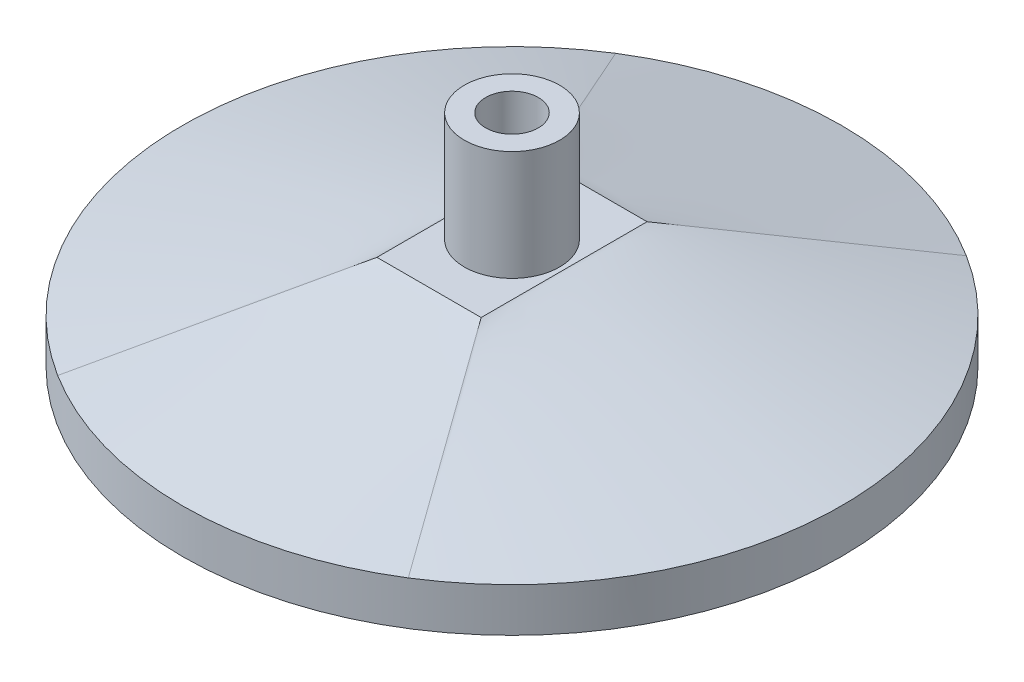
ISO-10303-21;
HEADER;
FILE_DESCRIPTION(('STEP AP214'),'2;1');
FILE_NAME('part.step','',(''),(''),'','','');
FILE_SCHEMA(('AUTOMOTIVE_DESIGN { 1 0 10303 214 1 1 1 1 }'));
ENDSEC;
DATA;
#1=APPLICATION_CONTEXT('core data for automotive mechanical design processes');
#2=APPLICATION_PROTOCOL_DEFINITION('international standard','automotive_design',2000,#1);
#3=PRODUCT_CONTEXT('',#1,'mechanical');
#4=PRODUCT('Part','Part','',(#3));
#5=PRODUCT_RELATED_PRODUCT_CATEGORY('part','',(#4));
#6=PRODUCT_DEFINITION_FORMATION('','',#4);
#7=PRODUCT_DEFINITION_CONTEXT('part definition',#1,'design');
#8=PRODUCT_DEFINITION('design','',#6,#7);
#9=PRODUCT_DEFINITION_SHAPE('','',#8);
#10=(LENGTH_UNIT() NAMED_UNIT(*) SI_UNIT(.MILLI.,.METRE.));
#11=(NAMED_UNIT(*) PLANE_ANGLE_UNIT() SI_UNIT($,.RADIAN.));
#12=(NAMED_UNIT(*) SI_UNIT($,.STERADIAN.) SOLID_ANGLE_UNIT());
#13=UNCERTAINTY_MEASURE_WITH_UNIT(LENGTH_MEASURE(1.E-05),#10,'distance_accuracy_value','');
#14=(GEOMETRIC_REPRESENTATION_CONTEXT(3) GLOBAL_UNCERTAINTY_ASSIGNED_CONTEXT((#13)) GLOBAL_UNIT_ASSIGNED_CONTEXT((#10,
#11,#12)) REPRESENTATION_CONTEXT('',''));
#15=CARTESIAN_POINT('',(0.,0.,0.));
#16=DIRECTION('',(0.,0.,1.));
#17=DIRECTION('',(1.,0.,0.));
#18=AXIS2_PLACEMENT_3D('',#15,#16,#17);
#19=CARTESIAN_POINT('',(0.,2.5,0.));
#20=DIRECTION('',(0.,1.,0.));
#21=DIRECTION('',(0.,0.,1.));
#22=AXIS2_PLACEMENT_3D('',#19,#20,#21);
#23=PLANE('',#22);
#24=CARTESIAN_POINT('',(0.,2.5,0.));
#25=DIRECTION('',(0.,1.,0.));
#26=DIRECTION('',(0.,0.,1.));
#27=AXIS2_PLACEMENT_3D('',#24,#25,#26);
#28=CIRCLE('',#27,1.085);
#29=CARTESIAN_POINT('',(0.,2.5,1.085));
#30=VERTEX_POINT('',#29);
#31=EDGE_CURVE('E12',#30,#30,#28,.T.);
#32=ORIENTED_EDGE('',*,*,#31,.T.);
#33=EDGE_LOOP('',(#32));
#34=FACE_BOUND('',#33,.T.);
#35=CARTESIAN_POINT('',(0.,2.5,0.));
#36=DIRECTION('',(0.,1.,0.));
#37=DIRECTION('',(0.,0.,1.));
#38=AXIS2_PLACEMENT_3D('',#35,#36,#37);
#39=CIRCLE('',#38,0.6);
#40=CARTESIAN_POINT('',(0.,2.5,0.6));
#41=VERTEX_POINT('',#40);
#42=EDGE_CURVE('E80',#41,#41,#39,.T.);
#43=ORIENTED_EDGE('',*,*,#42,.F.);
#44=EDGE_LOOP('',(#43));
#45=FACE_BOUND('',#44,.T.);
#46=ADVANCED_FACE('F69',(#34,#45),#23,.T.);
#47=CARTESIAN_POINT('',(0.,2.5,0.));
#48=DIRECTION('',(0.,-1.,0.));
#49=DIRECTION('',(0.,0.,-1.));
#50=AXIS2_PLACEMENT_3D('',#47,#48,#49);
#51=CYLINDRICAL_SURFACE('',#50,1.085);
#52=ORIENTED_EDGE('',*,*,#31,.F.);
#53=EDGE_LOOP('',(#52));
#54=FACE_BOUND('',#53,.T.);
#55=CARTESIAN_POINT('',(0.,0.,0.));
#56=DIRECTION('',(0.,1.,0.));
#57=DIRECTION('',(0.,0.,1.));
#58=AXIS2_PLACEMENT_3D('',#55,#56,#57);
#59=CIRCLE('',#58,1.085);
#60=CARTESIAN_POINT('',(0.,0.,1.085));
#61=VERTEX_POINT('',#60);
#62=EDGE_CURVE('E127',#61,#61,#59,.T.);
#63=ORIENTED_EDGE('',*,*,#62,.T.);
#64=EDGE_LOOP('',(#63));
#65=FACE_BOUND('',#64,.T.);
#66=ADVANCED_FACE('F71',(#54,#65),#51,.T.);
#67=CARTESIAN_POINT('',(0.,2.5,0.));
#68=DIRECTION('',(0.,-1.,0.));
#69=DIRECTION('',(0.,0.,-1.));
#70=AXIS2_PLACEMENT_3D('',#67,#68,#69);
#71=CYLINDRICAL_SURFACE('',#70,0.6);
#72=ORIENTED_EDGE('',*,*,#42,.T.);
#73=EDGE_LOOP('',(#72));
#74=FACE_BOUND('',#73,.T.);
#75=CARTESIAN_POINT('',(0.,0.,0.));
#76=DIRECTION('',(0.,1.,0.));
#77=DIRECTION('',(0.,0.,1.));
#78=AXIS2_PLACEMENT_3D('',#75,#76,#77);
#79=CIRCLE('',#78,0.6);
#80=CARTESIAN_POINT('',(0.,0.,0.6));
#81=VERTEX_POINT('',#80);
#82=EDGE_CURVE('E206',#81,#81,#79,.T.);
#83=ORIENTED_EDGE('',*,*,#82,.F.);
#84=EDGE_LOOP('',(#83));
#85=FACE_BOUND('',#84,.T.);
#86=ADVANCED_FACE('F186',(#74,#85),#71,.F.);
#87=CARTESIAN_POINT('',(0.,0.,0.));
#88=DIRECTION('',(0.,-1.,0.));
#89=DIRECTION('',(0.,0.,-1.));
#90=AXIS2_PLACEMENT_3D('',#87,#88,#89);
#91=PLANE('',#90);
#92=ORIENTED_EDGE('',*,*,#82,.T.);
#93=EDGE_LOOP('',(#92));
#94=FACE_BOUND('',#93,.T.);
#95=ADVANCED_FACE('F193',(#94),#91,.F.);
#96=ORIENTED_EDGE('',*,*,#62,.F.);
#97=EDGE_LOOP('',(#96));
#98=FACE_BOUND('',#97,.T.);
#99=DIRECTION('',(0.,0.,-1.));
#100=VECTOR('',#99,1.);
#101=CARTESIAN_POINT('',(-1.18652788247661,0.,1.88841761577262));
#102=LINE('',#101,#100);
#103=CARTESIAN_POINT('',(-1.18652788247661,0.,1.88841761577262));
#104=VERTEX_POINT('',#103);
#105=CARTESIAN_POINT('',(-1.18652788247661,0.,-1.88841761577263));
#106=VERTEX_POINT('',#105);
#107=EDGE_CURVE('E216',#104,#106,#102,.T.);
#108=ORIENTED_EDGE('',*,*,#107,.F.);
#109=DIRECTION('',(-1.,0.,0.));
#110=VECTOR('',#109,1.);
#111=CARTESIAN_POINT('',(-1.18652788247661,0.,1.88841761577262));
#112=LINE('',#111,#110);
#113=CARTESIAN_POINT('',(1.18652788247661,0.,1.88841761577262));
#114=VERTEX_POINT('',#113);
#115=EDGE_CURVE('E156',#114,#104,#112,.T.);
#116=ORIENTED_EDGE('',*,*,#115,.F.);
#117=DIRECTION('',(0.,0.,1.));
#118=VECTOR('',#117,1.);
#119=CARTESIAN_POINT('',(1.18652788247661,0.,1.88841761577262));
#120=LINE('',#119,#118);
#121=CARTESIAN_POINT('',(1.18652788247661,0.,-1.88841761577262));
#122=VERTEX_POINT('',#121);
#123=EDGE_CURVE('E144',#122,#114,#120,.T.);
#124=ORIENTED_EDGE('',*,*,#123,.F.);
#125=DIRECTION('',(1.,0.,0.));
#126=VECTOR('',#125,1.);
#127=CARTESIAN_POINT('',(-1.18652788247661,0.,-1.88841761577263));
#128=LINE('',#127,#126);
#129=EDGE_CURVE('E96',#106,#122,#128,.T.);
#130=ORIENTED_EDGE('',*,*,#129,.F.);
#131=EDGE_LOOP('',(#108,#116,#124,#130));
#132=FACE_BOUND('',#131,.T.);
#133=ADVANCED_FACE('F257',(#98,#132),#91,.F.);
#134=CARTESIAN_POINT('',(-1.18652788247661,0.,1.88841761577262));
#135=CARTESIAN_POINT('',(-3.99013557667776,-1.5,6.35049746710684));
#136=CARTESIAN_POINT('',(-1.18652788247661,0.,1.7310494811249));
#137=CARTESIAN_POINT('',(-4.43823355534143,-1.5,6.0689491796279));
#138=CARTESIAN_POINT('',(-1.18652788247661,0.,1.57368134647719));
#139=CARTESIAN_POINT('',(-4.8834399307523,-1.5,5.72272645320454));
#140=CARTESIAN_POINT('',(-1.18652788247661,0.,1.25894507718175));
#141=CARTESIAN_POINT('',(-5.71764060788763,-1.5,4.8893935712425));
#142=CARTESIAN_POINT('',(-1.18652788247661,0.,1.10157694253403));
#143=CARTESIAN_POINT('',(-6.10619327319107,-1.5,4.40186014247168));
#144=CARTESIAN_POINT('',(-1.18652788247661,0.,0.786840673238591));
#145=CARTESIAN_POINT('',(-6.76534367870258,-1.5,3.30031724421815));
#146=CARTESIAN_POINT('',(-1.18652788247661,0.,0.629472538590872));
#147=CARTESIAN_POINT('',(-7.03515812588266,-1.5,2.68628508210353));
#148=CARTESIAN_POINT('',(-1.18652788247661,0.,0.314736269295435));
#149=CARTESIAN_POINT('',(-7.40282004468644,-1.5,1.38124320251482));
#150=CARTESIAN_POINT('',(-1.18652788247661,0.,0.157368134647716));
#151=CARTESIAN_POINT('',(-7.5,-1.5,0.690864070394089));
#152=CARTESIAN_POINT('',(-1.18652788247661,0.,-0.157368134647721));
#153=CARTESIAN_POINT('',(-7.5,-1.5,-0.690864070394095));
#154=CARTESIAN_POINT('',(-1.18652788247661,0.,-0.31473626929544));
#155=CARTESIAN_POINT('',(-7.40282004468644,-1.5,-1.38124320251482));
#156=CARTESIAN_POINT('',(-1.18652788247661,0.,-0.629472538590877));
#157=CARTESIAN_POINT('',(-7.03515812588265,-1.5,-2.68628508210354));
#158=CARTESIAN_POINT('',(-1.18652788247661,0.,-0.786840673238595));
#159=CARTESIAN_POINT('',(-6.76534367870258,-1.5,-3.30031724421815));
#160=CARTESIAN_POINT('',(-1.18652788247661,0.,-1.10157694253403));
#161=CARTESIAN_POINT('',(-6.10619327319107,-1.5,-4.40186014247168));
#162=CARTESIAN_POINT('',(-1.18652788247661,0.,-1.25894507718175));
#163=CARTESIAN_POINT('',(-5.71764060788763,-1.5,-4.8893935712425));
#164=CARTESIAN_POINT('',(-1.18652788247661,0.,-1.57368134647719));
#165=CARTESIAN_POINT('',(-4.88343993075229,-1.5,-5.72272645320455));
#166=CARTESIAN_POINT('',(-1.18652788247661,0.,-1.73104948112491));
#167=CARTESIAN_POINT('',(-4.43823355534142,-1.5,-6.0689491796279));
#168=CARTESIAN_POINT('',(-1.18652788247661,0.,-1.88841761577262));
#169=CARTESIAN_POINT('',(-3.99013557667775,-1.5,-6.35049746710685));
#170=B_SPLINE_SURFACE_WITH_KNOTS('',3,1,((#134,#135),(#136,#137),(#138,#139),(#140,#141),(#142,
#143),(#144,#145),(#146,#147),(#148,#149),(#150,#151),(#152,#153),(#154,#155),(#156,#157),(#158,
#159),(#160,#161),(#162,#163),(#164,#165),(#166,#167),(#168,#169)),.UNSPECIFIED.,.F.,.F.,.F.,(4,
2,2,2,2,2,2,2,4),(2,2),(0.,0.125,0.25,0.375,0.5,0.625,0.75,0.875,1.),(0.,1.),.UNSPECIFIED.);
#171=DIRECTION('',(-0.511692678942984,-0.273768337846275,-0.814384122824751));
#172=VECTOR('',#171,1.);
#173=CARTESIAN_POINT('',(-2.58833172957718,-0.75,-4.11945754143974));
#174=LINE('',#173,#172);
#175=CARTESIAN_POINT('',(-3.99049768271403,-1.5,-6.35107568107875));
#176=VERTEX_POINT('',#175);
#177=EDGE_CURVE('E149',#106,#176,#174,.T.);
#178=CARTESIAN_POINT('',(0.,-1.5,0.));
#179=DIRECTION('',(0.,1.,0.));
#180=DIRECTION('',(0.,0.,1.));
#181=AXIS2_PLACEMENT_3D('',#178,#179,#180);
#182=CIRCLE('',#181,7.5);
#183=CARTESIAN_POINT('',(-3.9904918313569,-1.5,6.35106670749069));
#184=VERTEX_POINT('',#183);
#185=EDGE_CURVE('E73',#176,#184,#182,.T.);
#186=DIRECTION('',(0.511692678942986,0.273768337846275,-0.81438412282475));
#187=VECTOR('',#186,1.);
#188=CARTESIAN_POINT('',(-2.58833172957718,-0.75,4.11945754143973));
#189=LINE('',#188,#187);
#190=EDGE_CURVE('E138',#184,#104,#189,.T.);
#191=ORIENTED_EDGE('',*,*,#107,.T.);
#192=ORIENTED_EDGE('',*,*,#177,.T.);
#193=ORIENTED_EDGE('',*,*,#185,.T.);
#194=ORIENTED_EDGE('',*,*,#190,.T.);
#195=EDGE_LOOP('',(#191,#192,#193,#194));
#196=FACE_BOUND('',#195,.T.);
#197=ADVANCED_FACE('F240',(#196),#170,.T.);
#198=CARTESIAN_POINT('',(-1.18652788247661,0.,-1.88841761577263));
#199=CARTESIAN_POINT('',(-3.99013557667775,-1.5,-6.35049746710685));
#200=CARTESIAN_POINT('',(-0.988773235397171,0.,-1.88841761577263));
#201=CARTESIAN_POINT('',(-3.42703900171986,-1.5,-6.7043015097795));
#202=CARTESIAN_POINT('',(-0.791018588317737,0.,-1.88841761577263));
#203=CARTESIAN_POINT('',(-2.79361860094154,-1.5,-6.99596541617301));
#204=CARTESIAN_POINT('',(-0.395509294158868,0.,-1.88841761577263));
#205=CARTESIAN_POINT('',(-1.43983527330271,-1.5,-7.39423500962531));
#206=CARTESIAN_POINT('',(-0.197754647079434,0.,-1.88841761577262));
#207=CARTESIAN_POINT('',(-0.720215209986826,-1.5,-7.5));
#208=CARTESIAN_POINT('',(0.197754647079435,0.,-1.88841761577262));
#209=CARTESIAN_POINT('',(0.720215209986831,-1.5,-7.5));
#210=CARTESIAN_POINT('',(0.395509294158869,0.,-1.88841761577262));
#211=CARTESIAN_POINT('',(1.43983527330272,-1.5,-7.39423500962531));
#212=CARTESIAN_POINT('',(0.791018588317737,0.,-1.88841761577262));
#213=CARTESIAN_POINT('',(2.79361860094155,-1.5,-6.99596541617301));
#214=CARTESIAN_POINT('',(0.988773235397172,0.,-1.88841761577262));
#215=CARTESIAN_POINT('',(3.42703900171987,-1.5,-6.7043015097795));
#216=CARTESIAN_POINT('',(1.18652788247661,0.,-1.88841761577262));
#217=CARTESIAN_POINT('',(3.99013557667776,-1.5,-6.35049746710684));
#218=B_SPLINE_SURFACE_WITH_KNOTS('',3,1,((#198,#199),(#200,#201),(#202,#203),(#204,#205),(#206,
#207),(#208,#209),(#210,#211),(#212,#213),(#214,#215),(#216,#217)),.UNSPECIFIED.,.F.,.F.,.F.,(4,
2,2,2,4),(2,2),(0.,0.25,0.5,0.75,1.),(0.,1.),.UNSPECIFIED.);
#219=DIRECTION('',(0.511692678942986,-0.273768337846276,-0.81438412282475));
#220=VECTOR('',#219,1.);
#221=CARTESIAN_POINT('',(2.58833172957718,-0.75,-4.11945754143974));
#222=LINE('',#221,#220);
#223=CARTESIAN_POINT('',(3.99049183135683,-1.5,-6.35106670749058));
#224=VERTEX_POINT('',#223);
#225=EDGE_CURVE('E146',#122,#224,#222,.T.);
#226=EDGE_CURVE('E119',#224,#176,#182,.T.);
#227=ORIENTED_EDGE('',*,*,#129,.T.);
#228=ORIENTED_EDGE('',*,*,#225,.T.);
#229=ORIENTED_EDGE('',*,*,#226,.T.);
#230=ORIENTED_EDGE('',*,*,#177,.F.);
#231=EDGE_LOOP('',(#227,#228,#229,#230));
#232=FACE_BOUND('',#231,.T.);
#233=ADVANCED_FACE('F256',(#232),#218,.T.);
#234=CARTESIAN_POINT('',(1.18652788247661,0.,1.88841761577262));
#235=CARTESIAN_POINT('',(3.99013557667776,-1.5,6.35049746710685));
#236=CARTESIAN_POINT('',(0.988773235397172,0.,1.88841761577262));
#237=CARTESIAN_POINT('',(3.42703900171987,-1.5,6.7043015097795));
#238=CARTESIAN_POINT('',(0.791018588317738,0.,1.88841761577262));
#239=CARTESIAN_POINT('',(2.79361860094155,-1.5,6.99596541617301));
#240=CARTESIAN_POINT('',(0.395509294158869,0.,1.88841761577262));
#241=CARTESIAN_POINT('',(1.43983527330272,-1.5,7.39423500962531));
#242=CARTESIAN_POINT('',(0.197754647079435,0.,1.88841761577262));
#243=CARTESIAN_POINT('',(0.720215209986828,-1.5,7.5));
#244=CARTESIAN_POINT('',(-0.197754647079434,0.,1.88841761577262));
#245=CARTESIAN_POINT('',(-0.72021520998683,-1.5,7.5));
#246=CARTESIAN_POINT('',(-0.395509294158868,0.,1.88841761577262));
#247=CARTESIAN_POINT('',(-1.43983527330272,-1.5,7.39423500962531));
#248=CARTESIAN_POINT('',(-0.791018588317737,0.,1.88841761577262));
#249=CARTESIAN_POINT('',(-2.79361860094155,-1.5,6.99596541617301));
#250=CARTESIAN_POINT('',(-0.988773235397171,0.,1.88841761577262));
#251=CARTESIAN_POINT('',(-3.42703900171987,-1.5,6.7043015097795));
#252=CARTESIAN_POINT('',(-1.18652788247661,0.,1.88841761577262));
#253=CARTESIAN_POINT('',(-3.99013557667776,-1.5,6.35049746710684));
#254=B_SPLINE_SURFACE_WITH_KNOTS('',3,1,((#234,#235),(#236,#237),(#238,#239),(#240,#241),(#242,
#243),(#244,#245),(#246,#247),(#248,#249),(#250,#251),(#252,#253)),.UNSPECIFIED.,.F.,.F.,.F.,(4,
2,2,2,4),(2,2),(0.,0.25,0.5,0.75,1.),(0.,1.),.UNSPECIFIED.);
#255=CARTESIAN_POINT('',(3.990497682714,-1.5,6.35107568107869));
#256=VERTEX_POINT('',#255);
#257=EDGE_CURVE('E117',#184,#256,#182,.T.);
#258=DIRECTION('',(0.511692678942985,-0.273768337846275,0.814384122824751));
#259=VECTOR('',#258,1.);
#260=CARTESIAN_POINT('',(2.58833172957718,-0.75,4.11945754143974));
#261=LINE('',#260,#259);
#262=EDGE_CURVE('E137',#114,#256,#261,.T.);
#263=ORIENTED_EDGE('',*,*,#115,.T.);
#264=ORIENTED_EDGE('',*,*,#190,.F.);
#265=ORIENTED_EDGE('',*,*,#257,.T.);
#266=ORIENTED_EDGE('',*,*,#262,.F.);
#267=EDGE_LOOP('',(#263,#264,#265,#266));
#268=FACE_BOUND('',#267,.T.);
#269=ADVANCED_FACE('F136',(#268),#254,.T.);
#270=CARTESIAN_POINT('',(1.18652788247661,0.,-1.88841761577262));
#271=CARTESIAN_POINT('',(3.99013557667776,-1.5,-6.35049746710684));
#272=CARTESIAN_POINT('',(1.18652788247661,0.,-1.73104948112491));
#273=CARTESIAN_POINT('',(4.43823355534143,-1.5,-6.0689491796279));
#274=CARTESIAN_POINT('',(1.18652788247661,0.,-1.57368134647719));
#275=CARTESIAN_POINT('',(4.88343993075229,-1.5,-5.72272645320454));
#276=CARTESIAN_POINT('',(1.18652788247661,0.,-1.25894507718176));
#277=CARTESIAN_POINT('',(5.71764060788763,-1.5,-4.8893935712425));
#278=CARTESIAN_POINT('',(1.18652788247661,0.,-1.10157694253404));
#279=CARTESIAN_POINT('',(6.10619327319107,-1.5,-4.40186014247168));
#280=CARTESIAN_POINT('',(1.18652788247661,0.,-0.786840673238609));
#281=CARTESIAN_POINT('',(6.76534367870258,-1.5,-3.30031724421815));
#282=CARTESIAN_POINT('',(1.18652788247661,0.,-0.629472538590892));
#283=CARTESIAN_POINT('',(7.03515812588265,-1.5,-2.68628508210353));
#284=CARTESIAN_POINT('',(1.18652788247661,0.,-0.314736269295456));
#285=CARTESIAN_POINT('',(7.40282004468644,-1.5,-1.38124320251482));
#286=CARTESIAN_POINT('',(1.18652788247661,0.,-0.157368134647737));
#287=CARTESIAN_POINT('',(7.5,-1.5,-0.69086407039409));
#288=CARTESIAN_POINT('',(1.18652788247661,0.,0.1573681346477));
#289=CARTESIAN_POINT('',(7.5,-1.5,0.690864070394093));
#290=CARTESIAN_POINT('',(1.18652788247661,0.,0.314736269295419));
#291=CARTESIAN_POINT('',(7.40282004468644,-1.5,1.38124320251482));
#292=CARTESIAN_POINT('',(1.18652788247661,0.,0.629472538590858));
#293=CARTESIAN_POINT('',(7.03515812588265,-1.5,2.68628508210353));
#294=CARTESIAN_POINT('',(1.18652788247661,0.,0.786840673238578));
#295=CARTESIAN_POINT('',(6.76534367870258,-1.5,3.30031724421815));
#296=CARTESIAN_POINT('',(1.18652788247661,0.,1.10157694253402));
#297=CARTESIAN_POINT('',(6.10619327319107,-1.5,4.40186014247168));
#298=CARTESIAN_POINT('',(1.18652788247661,0.,1.25894507718174));
#299=CARTESIAN_POINT('',(5.71764060788763,-1.5,4.8893935712425));
#300=CARTESIAN_POINT('',(1.18652788247661,0.,1.57368134647718));
#301=CARTESIAN_POINT('',(4.8834399307523,-1.5,5.72272645320454));
#302=CARTESIAN_POINT('',(1.18652788247661,0.,1.7310494811249));
#303=CARTESIAN_POINT('',(4.43823355534143,-1.5,6.0689491796279));
#304=CARTESIAN_POINT('',(1.18652788247661,0.,1.88841761577262));
#305=CARTESIAN_POINT('',(3.99013557667776,-1.5,6.35049746710685));
#306=B_SPLINE_SURFACE_WITH_KNOTS('',3,1,((#270,#271),(#272,#273),(#274,#275),(#276,#277),(#278,
#279),(#280,#281),(#282,#283),(#284,#285),(#286,#287),(#288,#289),(#290,#291),(#292,#293),(#294,
#295),(#296,#297),(#298,#299),(#300,#301),(#302,#303),(#304,#305)),.UNSPECIFIED.,.F.,.F.,.F.,(4,
2,2,2,2,2,2,2,4),(2,2),(0.,0.125,0.25,0.375,0.5,0.625,0.75,0.875,1.),(0.,1.),.UNSPECIFIED.);
#307=EDGE_CURVE('E113',#256,#224,#182,.T.);
#308=ORIENTED_EDGE('',*,*,#123,.T.);
#309=ORIENTED_EDGE('',*,*,#262,.T.);
#310=ORIENTED_EDGE('',*,*,#307,.T.);
#311=ORIENTED_EDGE('',*,*,#225,.F.);
#312=EDGE_LOOP('',(#308,#309,#310,#311));
#313=FACE_BOUND('',#312,.T.);
#314=ADVANCED_FACE('F143',(#313),#306,.T.);
#315=CARTESIAN_POINT('',(0.,-2.5,0.));
#316=DIRECTION('',(0.,1.,0.));
#317=DIRECTION('',(0.,0.,1.));
#318=AXIS2_PLACEMENT_3D('',#315,#316,#317);
#319=CYLINDRICAL_SURFACE('',#318,7.5);
#320=CARTESIAN_POINT('',(0.,-2.5,0.));
#321=DIRECTION('',(0.,1.,0.));
#322=DIRECTION('',(0.,0.,1.));
#323=AXIS2_PLACEMENT_3D('',#320,#321,#322);
#324=CIRCLE('',#323,7.5);
#325=CARTESIAN_POINT('',(0.,-2.5,7.5));
#326=VERTEX_POINT('',#325);
#327=EDGE_CURVE('E390',#326,#326,#324,.T.);
#328=ORIENTED_EDGE('',*,*,#327,.T.);
#329=EDGE_LOOP('',(#328));
#330=FACE_BOUND('',#329,.T.);
#331=ORIENTED_EDGE('',*,*,#307,.F.);
#332=ORIENTED_EDGE('',*,*,#257,.F.);
#333=ORIENTED_EDGE('',*,*,#185,.F.);
#334=ORIENTED_EDGE('',*,*,#226,.F.);
#335=EDGE_LOOP('',(#331,#332,#333,#334));
#336=FACE_BOUND('',#335,.T.);
#337=ADVANCED_FACE('F116',(#330,#336),#319,.T.);
#338=CARTESIAN_POINT('',(0.,-2.5,0.));
#339=DIRECTION('',(0.,1.,0.));
#340=DIRECTION('',(0.,0.,1.));
#341=AXIS2_PLACEMENT_3D('',#338,#339,#340);
#342=PLANE('',#341);
#343=CARTESIAN_POINT('',(0.,-2.5,0.));
#344=DIRECTION('',(0.,1.,0.));
#345=DIRECTION('',(0.,0.,1.));
#346=AXIS2_PLACEMENT_3D('',#343,#344,#345);
#347=CIRCLE('',#346,6.3228756555323);
#348=CARTESIAN_POINT('',(0.,-2.5,6.3228756555323));
#349=VERTEX_POINT('',#348);
#350=EDGE_CURVE('E219',#349,#349,#347,.T.);
#351=ORIENTED_EDGE('',*,*,#350,.T.);
#352=EDGE_LOOP('',(#351));
#353=FACE_BOUND('',#352,.T.);
#354=ORIENTED_EDGE('',*,*,#327,.F.);
#355=EDGE_LOOP('',(#354));
#356=FACE_BOUND('',#355,.T.);
#357=ADVANCED_FACE('F288',(#353,#356),#342,.F.);
#358=CARTESIAN_POINT('',(0.,-2.,0.));
#359=DIRECTION('',(0.,-1.,0.));
#360=DIRECTION('',(0.,0.,-1.));
#361=AXIS2_PLACEMENT_3D('',#358,#359,#360);
#362=PLANE('',#361);
#363=CARTESIAN_POINT('',(0.,-2.,0.));
#364=DIRECTION('',(0.,-1.,0.));
#365=DIRECTION('',(0.,0.,-1.));
#366=AXIS2_PLACEMENT_3D('',#363,#364,#365);
#367=CIRCLE('',#366,5.);
#368=CARTESIAN_POINT('',(0.,-2.,-5.));
#369=VERTEX_POINT('',#368);
#370=EDGE_CURVE('E388',#369,#369,#367,.T.);
#371=ORIENTED_EDGE('',*,*,#370,.T.);
#372=EDGE_LOOP('',(#371));
#373=FACE_BOUND('',#372,.T.);
#374=ADVANCED_FACE('F296',(#373),#362,.T.);
#375=CARTESIAN_POINT('',(0.,-0.5,0.));
#376=DIRECTION('',(0.,1.,0.));
#377=DIRECTION('',(0.,0.,1.));
#378=AXIS2_PLACEMENT_3D('',#375,#376,#377);
#379=TOROIDAL_SURFACE('',#378,6.3228756555323,2.);
#380=ORIENTED_EDGE('',*,*,#350,.F.);
#381=EDGE_LOOP('',(#380));
#382=FACE_BOUND('',#381,.T.);
#383=ORIENTED_EDGE('',*,*,#370,.F.);
#384=EDGE_LOOP('',(#383));
#385=FACE_BOUND('',#384,.T.);
#386=ADVANCED_FACE('F304',(#382,#385),#379,.T.);
#387=CLOSED_SHELL('',(#46,#66,#86,#95,#133,#197,#233,#269,#314,#337,#357,#374,#386));
#388=MANIFOLD_SOLID_BREP('B2',#387);
#389=ADVANCED_BREP_SHAPE_REPRESENTATION('',(#18,#388),#14);
#390=SHAPE_DEFINITION_REPRESENTATION(#9,#389);
ENDSEC;
END-ISO-10303-21;
